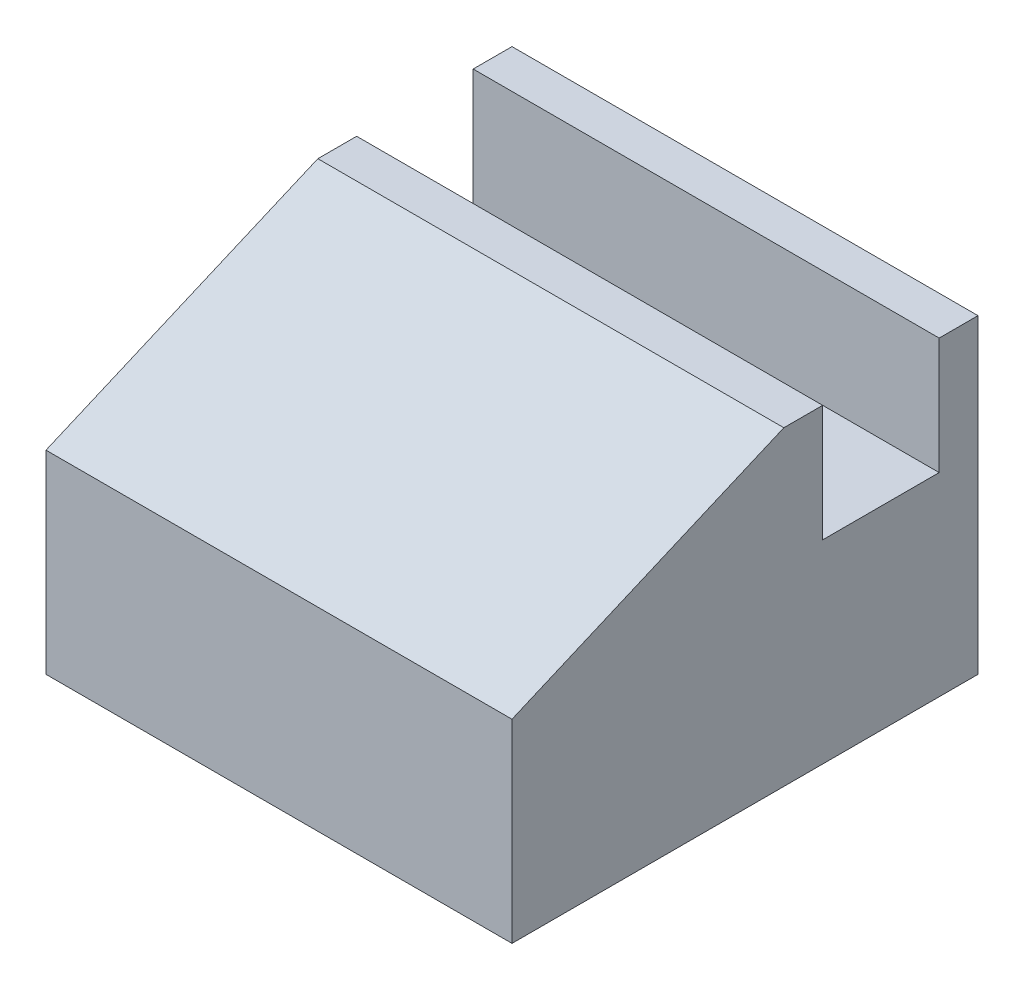
ISO-10303-21;
HEADER;
FILE_DESCRIPTION(('STEP AP214'),'2;1');
FILE_NAME('part.step','',(''),(''),'','','');
FILE_SCHEMA(('AUTOMOTIVE_DESIGN { 1 0 10303 214 1 1 1 1 }'));
ENDSEC;
DATA;
#1=APPLICATION_CONTEXT('core data for automotive mechanical design processes');
#2=APPLICATION_PROTOCOL_DEFINITION('international standard','automotive_design',2000,#1);
#3=PRODUCT_CONTEXT('',#1,'mechanical');
#4=PRODUCT('Part','Part','',(#3));
#5=PRODUCT_RELATED_PRODUCT_CATEGORY('part','',(#4));
#6=PRODUCT_DEFINITION_FORMATION('','',#4);
#7=PRODUCT_DEFINITION_CONTEXT('part definition',#1,'design');
#8=PRODUCT_DEFINITION('design','',#6,#7);
#9=PRODUCT_DEFINITION_SHAPE('','',#8);
#10=(LENGTH_UNIT() NAMED_UNIT(*) SI_UNIT(.MILLI.,.METRE.));
#11=(NAMED_UNIT(*) PLANE_ANGLE_UNIT() SI_UNIT($,.RADIAN.));
#12=(NAMED_UNIT(*) SI_UNIT($,.STERADIAN.) SOLID_ANGLE_UNIT());
#13=UNCERTAINTY_MEASURE_WITH_UNIT(LENGTH_MEASURE(1.E-05),#10,'distance_accuracy_value','');
#14=(GEOMETRIC_REPRESENTATION_CONTEXT(3) GLOBAL_UNCERTAINTY_ASSIGNED_CONTEXT((#13)) GLOBAL_UNIT_ASSIGNED_CONTEXT((#10,
#11,#12)) REPRESENTATION_CONTEXT('',''));
#15=CARTESIAN_POINT('',(0.,0.,0.));
#16=DIRECTION('',(0.,0.,1.));
#17=DIRECTION('',(1.,0.,0.));
#18=AXIS2_PLACEMENT_3D('',#15,#16,#17);
#19=CARTESIAN_POINT('',(76.2,-50.8,0.));
#20=DIRECTION('',(0.,1.,0.));
#21=DIRECTION('',(0.,0.,1.));
#22=AXIS2_PLACEMENT_3D('',#19,#20,#21);
#23=PLANE('',#22);
#24=DIRECTION('',(0.,0.,-1.));
#25=VECTOR('',#24,1.);
#26=CARTESIAN_POINT('',(0.,-50.8,0.));
#27=LINE('',#26,#25);
#28=CARTESIAN_POINT('',(0.,-50.8,76.2));
#29=VERTEX_POINT('',#28);
#30=CARTESIAN_POINT('',(0.,-50.8,0.));
#31=VERTEX_POINT('',#30);
#32=EDGE_CURVE('E223',#29,#31,#27,.T.);
#33=ORIENTED_EDGE('',*,*,#32,.T.);
#34=DIRECTION('',(-1.,0.,0.));
#35=VECTOR('',#34,1.);
#36=CARTESIAN_POINT('',(76.2,-50.8,0.));
#37=LINE('',#36,#35);
#38=CARTESIAN_POINT('',(76.2,-50.8,0.));
#39=VERTEX_POINT('',#38);
#40=EDGE_CURVE('E12',#39,#31,#37,.T.);
#41=ORIENTED_EDGE('',*,*,#40,.F.);
#42=DIRECTION('',(0.,0.,-1.));
#43=VECTOR('',#42,1.);
#44=CARTESIAN_POINT('',(76.2,-50.8,0.));
#45=LINE('',#44,#43);
#46=CARTESIAN_POINT('',(76.2,-50.8,76.2));
#47=VERTEX_POINT('',#46);
#48=EDGE_CURVE('E203',#47,#39,#45,.T.);
#49=ORIENTED_EDGE('',*,*,#48,.F.);
#50=DIRECTION('',(-1.,0.,0.));
#51=VECTOR('',#50,1.);
#52=CARTESIAN_POINT('',(76.2,-50.8,76.2));
#53=LINE('',#52,#51);
#54=EDGE_CURVE('E151',#47,#29,#53,.T.);
#55=ORIENTED_EDGE('',*,*,#54,.T.);
#56=EDGE_LOOP('',(#33,#41,#49,#55));
#57=FACE_BOUND('',#56,.T.);
#58=ADVANCED_FACE('F48',(#57),#23,.F.);
#59=CARTESIAN_POINT('',(76.2,0.,0.));
#60=DIRECTION('',(0.,0.,1.));
#61=DIRECTION('',(0.,-1.,0.));
#62=AXIS2_PLACEMENT_3D('',#59,#60,#61);
#63=PLANE('',#62);
#64=DIRECTION('',(0.,1.,0.));
#65=VECTOR('',#64,1.);
#66=CARTESIAN_POINT('',(0.,0.,0.));
#67=LINE('',#66,#65);
#68=CARTESIAN_POINT('',(0.,0.,0.));
#69=VERTEX_POINT('',#68);
#70=EDGE_CURVE('E221',#31,#69,#67,.T.);
#71=ORIENTED_EDGE('',*,*,#70,.T.);
#72=DIRECTION('',(-1.,0.,0.));
#73=VECTOR('',#72,1.);
#74=CARTESIAN_POINT('',(76.2,0.,0.));
#75=LINE('',#74,#73);
#76=CARTESIAN_POINT('',(76.2,0.,0.));
#77=VERTEX_POINT('',#76);
#78=EDGE_CURVE('E57',#77,#69,#75,.T.);
#79=ORIENTED_EDGE('',*,*,#78,.F.);
#80=DIRECTION('',(0.,1.,0.));
#81=VECTOR('',#80,1.);
#82=CARTESIAN_POINT('',(76.2,0.,0.));
#83=LINE('',#82,#81);
#84=EDGE_CURVE('E111',#39,#77,#83,.T.);
#85=ORIENTED_EDGE('',*,*,#84,.F.);
#86=ORIENTED_EDGE('',*,*,#40,.T.);
#87=EDGE_LOOP('',(#71,#79,#85,#86));
#88=FACE_BOUND('',#87,.T.);
#89=ADVANCED_FACE('F241',(#88),#63,.F.);
#90=CARTESIAN_POINT('',(76.2,0.,6.34999999999999));
#91=DIRECTION('',(0.,-1.,0.));
#92=DIRECTION('',(0.,0.,-1.));
#93=AXIS2_PLACEMENT_3D('',#90,#91,#92);
#94=PLANE('',#93);
#95=DIRECTION('',(0.,0.,1.));
#96=VECTOR('',#95,1.);
#97=CARTESIAN_POINT('',(0.,0.,6.34999999999999));
#98=LINE('',#97,#96);
#99=CARTESIAN_POINT('',(0.,0.,6.34999999999999));
#100=VERTEX_POINT('',#99);
#101=EDGE_CURVE('E218',#69,#100,#98,.T.);
#102=ORIENTED_EDGE('',*,*,#101,.T.);
#103=DIRECTION('',(-1.,0.,0.));
#104=VECTOR('',#103,1.);
#105=CARTESIAN_POINT('',(76.2,0.,6.34999999999999));
#106=LINE('',#105,#104);
#107=CARTESIAN_POINT('',(76.2,0.,6.34999999999999));
#108=VERTEX_POINT('',#107);
#109=EDGE_CURVE('E178',#108,#100,#106,.T.);
#110=ORIENTED_EDGE('',*,*,#109,.F.);
#111=DIRECTION('',(0.,0.,1.));
#112=VECTOR('',#111,1.);
#113=CARTESIAN_POINT('',(76.2,0.,6.34999999999999));
#114=LINE('',#113,#112);
#115=EDGE_CURVE('E189',#77,#108,#114,.T.);
#116=ORIENTED_EDGE('',*,*,#115,.F.);
#117=ORIENTED_EDGE('',*,*,#78,.T.);
#118=EDGE_LOOP('',(#102,#110,#116,#117));
#119=FACE_BOUND('',#118,.T.);
#120=ADVANCED_FACE('F246',(#119),#94,.F.);
#121=CARTESIAN_POINT('',(76.2,-19.05,6.34999999999999));
#122=DIRECTION('',(0.,0.,-1.));
#123=DIRECTION('',(-1.,0.,0.));
#124=AXIS2_PLACEMENT_3D('',#121,#122,#123);
#125=PLANE('',#124);
#126=DIRECTION('',(0.,-1.,0.));
#127=VECTOR('',#126,1.);
#128=CARTESIAN_POINT('',(0.,-19.05,6.34999999999999));
#129=LINE('',#128,#127);
#130=CARTESIAN_POINT('',(0.,-19.05,6.34999999999999));
#131=VERTEX_POINT('',#130);
#132=EDGE_CURVE('E215',#100,#131,#129,.T.);
#133=ORIENTED_EDGE('',*,*,#132,.T.);
#134=DIRECTION('',(-1.,0.,0.));
#135=VECTOR('',#134,1.);
#136=CARTESIAN_POINT('',(76.2,-19.05,6.34999999999999));
#137=LINE('',#136,#135);
#138=CARTESIAN_POINT('',(76.2,-19.05,6.34999999999999));
#139=VERTEX_POINT('',#138);
#140=EDGE_CURVE('E174',#139,#131,#137,.T.);
#141=ORIENTED_EDGE('',*,*,#140,.F.);
#142=DIRECTION('',(0.,-1.,0.));
#143=VECTOR('',#142,1.);
#144=CARTESIAN_POINT('',(76.2,-19.05,6.34999999999999));
#145=LINE('',#144,#143);
#146=EDGE_CURVE('E194',#108,#139,#145,.T.);
#147=ORIENTED_EDGE('',*,*,#146,.F.);
#148=ORIENTED_EDGE('',*,*,#109,.T.);
#149=EDGE_LOOP('',(#133,#141,#147,#148));
#150=FACE_BOUND('',#149,.T.);
#151=ADVANCED_FACE('F250',(#150),#125,.F.);
#152=CARTESIAN_POINT('',(76.2,-19.05,25.4));
#153=DIRECTION('',(0.,-1.,0.));
#154=DIRECTION('',(0.,0.,-1.));
#155=AXIS2_PLACEMENT_3D('',#152,#153,#154);
#156=PLANE('',#155);
#157=DIRECTION('',(0.,0.,1.));
#158=VECTOR('',#157,1.);
#159=CARTESIAN_POINT('',(0.,-19.05,25.4));
#160=LINE('',#159,#158);
#161=CARTESIAN_POINT('',(0.,-19.05,25.4));
#162=VERTEX_POINT('',#161);
#163=EDGE_CURVE('E212',#131,#162,#160,.T.);
#164=ORIENTED_EDGE('',*,*,#163,.T.);
#165=DIRECTION('',(-1.,0.,0.));
#166=VECTOR('',#165,1.);
#167=CARTESIAN_POINT('',(76.2,-19.05,25.4));
#168=LINE('',#167,#166);
#169=CARTESIAN_POINT('',(76.2,-19.05,25.4));
#170=VERTEX_POINT('',#169);
#171=EDGE_CURVE('E170',#170,#162,#168,.T.);
#172=ORIENTED_EDGE('',*,*,#171,.F.);
#173=DIRECTION('',(0.,0.,1.));
#174=VECTOR('',#173,1.);
#175=CARTESIAN_POINT('',(76.2,-19.05,25.4));
#176=LINE('',#175,#174);
#177=EDGE_CURVE('E198',#139,#170,#176,.T.);
#178=ORIENTED_EDGE('',*,*,#177,.F.);
#179=ORIENTED_EDGE('',*,*,#140,.T.);
#180=EDGE_LOOP('',(#164,#172,#178,#179));
#181=FACE_BOUND('',#180,.T.);
#182=ADVANCED_FACE('F254',(#181),#156,.F.);
#183=CARTESIAN_POINT('',(76.2,0.,25.4));
#184=DIRECTION('',(0.,0.,1.));
#185=DIRECTION('',(0.,-1.,0.));
#186=AXIS2_PLACEMENT_3D('',#183,#184,#185);
#187=PLANE('',#186);
#188=DIRECTION('',(0.,1.,0.));
#189=VECTOR('',#188,1.);
#190=CARTESIAN_POINT('',(0.,0.,25.4));
#191=LINE('',#190,#189);
#192=CARTESIAN_POINT('',(0.,0.,25.4));
#193=VERTEX_POINT('',#192);
#194=EDGE_CURVE('E210',#162,#193,#191,.T.);
#195=ORIENTED_EDGE('',*,*,#194,.T.);
#196=DIRECTION('',(-1.,0.,0.));
#197=VECTOR('',#196,1.);
#198=CARTESIAN_POINT('',(76.2,0.,25.4));
#199=LINE('',#198,#197);
#200=CARTESIAN_POINT('',(76.2,0.,25.4));
#201=VERTEX_POINT('',#200);
#202=EDGE_CURVE('E144',#201,#193,#199,.T.);
#203=ORIENTED_EDGE('',*,*,#202,.F.);
#204=DIRECTION('',(0.,1.,0.));
#205=VECTOR('',#204,1.);
#206=CARTESIAN_POINT('',(76.2,0.,25.4));
#207=LINE('',#206,#205);
#208=EDGE_CURVE('E133',#170,#201,#207,.T.);
#209=ORIENTED_EDGE('',*,*,#208,.F.);
#210=ORIENTED_EDGE('',*,*,#171,.T.);
#211=EDGE_LOOP('',(#195,#203,#209,#210));
#212=FACE_BOUND('',#211,.T.);
#213=ADVANCED_FACE('F258',(#212),#187,.F.);
#214=CARTESIAN_POINT('',(76.2,0.,31.75));
#215=DIRECTION('',(0.,-1.,0.));
#216=DIRECTION('',(0.,0.,-1.));
#217=AXIS2_PLACEMENT_3D('',#214,#215,#216);
#218=PLANE('',#217);
#219=DIRECTION('',(0.,0.,1.));
#220=VECTOR('',#219,1.);
#221=CARTESIAN_POINT('',(0.,0.,31.75));
#222=LINE('',#221,#220);
#223=CARTESIAN_POINT('',(0.,0.,31.75));
#224=VERTEX_POINT('',#223);
#225=EDGE_CURVE('E142',#193,#224,#222,.T.);
#226=ORIENTED_EDGE('',*,*,#225,.T.);
#227=DIRECTION('',(-1.,0.,0.));
#228=VECTOR('',#227,1.);
#229=CARTESIAN_POINT('',(76.2,0.,31.75));
#230=LINE('',#229,#228);
#231=CARTESIAN_POINT('',(76.2,0.,31.75));
#232=VERTEX_POINT('',#231);
#233=EDGE_CURVE('E139',#232,#224,#230,.T.);
#234=ORIENTED_EDGE('',*,*,#233,.F.);
#235=DIRECTION('',(0.,0.,1.));
#236=VECTOR('',#235,1.);
#237=CARTESIAN_POINT('',(76.2,0.,31.75));
#238=LINE('',#237,#236);
#239=EDGE_CURVE('E127',#201,#232,#238,.T.);
#240=ORIENTED_EDGE('',*,*,#239,.F.);
#241=ORIENTED_EDGE('',*,*,#202,.T.);
#242=EDGE_LOOP('',(#226,#234,#240,#241));
#243=FACE_BOUND('',#242,.T.);
#244=ADVANCED_FACE('F140',(#243),#218,.F.);
#245=CARTESIAN_POINT('',(76.2,-19.05,76.2));
#246=DIRECTION('',(0.,-0.919145030018058,-0.393919298579168));
#247=DIRECTION('',(0.,0.393919298579168,-0.919145030018058));
#248=AXIS2_PLACEMENT_3D('',#245,#246,#247);
#249=PLANE('',#248);
#250=DIRECTION('',(0.,-0.393919298579168,0.919145030018058));
#251=VECTOR('',#250,1.);
#252=CARTESIAN_POINT('',(0.,-19.05,76.2));
#253=LINE('',#252,#251);
#254=CARTESIAN_POINT('',(0.,-19.05,76.2));
#255=VERTEX_POINT('',#254);
#256=EDGE_CURVE('E97',#224,#255,#253,.T.);
#257=ORIENTED_EDGE('',*,*,#256,.T.);
#258=DIRECTION('',(-1.,0.,0.));
#259=VECTOR('',#258,1.);
#260=CARTESIAN_POINT('',(76.2,-19.05,76.2));
#261=LINE('',#260,#259);
#262=CARTESIAN_POINT('',(76.2,-19.05,76.2));
#263=VERTEX_POINT('',#262);
#264=EDGE_CURVE('E145',#263,#255,#261,.T.);
#265=ORIENTED_EDGE('',*,*,#264,.F.);
#266=DIRECTION('',(0.,-0.393919298579168,0.919145030018058));
#267=VECTOR('',#266,1.);
#268=CARTESIAN_POINT('',(76.2,-19.05,76.2));
#269=LINE('',#268,#267);
#270=EDGE_CURVE('E131',#232,#263,#269,.T.);
#271=ORIENTED_EDGE('',*,*,#270,.F.);
#272=ORIENTED_EDGE('',*,*,#233,.T.);
#273=EDGE_LOOP('',(#257,#265,#271,#272));
#274=FACE_BOUND('',#273,.T.);
#275=ADVANCED_FACE('F147',(#274),#249,.F.);
#276=CARTESIAN_POINT('',(76.2,-50.8,76.2));
#277=DIRECTION('',(0.,0.,-1.));
#278=DIRECTION('',(-1.,0.,0.));
#279=AXIS2_PLACEMENT_3D('',#276,#277,#278);
#280=PLANE('',#279);
#281=DIRECTION('',(0.,-1.,0.));
#282=VECTOR('',#281,1.);
#283=CARTESIAN_POINT('',(0.,-50.8,76.2));
#284=LINE('',#283,#282);
#285=EDGE_CURVE('E103',#255,#29,#284,.T.);
#286=ORIENTED_EDGE('',*,*,#285,.T.);
#287=ORIENTED_EDGE('',*,*,#54,.F.);
#288=DIRECTION('',(0.,-1.,0.));
#289=VECTOR('',#288,1.);
#290=CARTESIAN_POINT('',(76.2,-50.8,76.2));
#291=LINE('',#290,#289);
#292=EDGE_CURVE('E65',#263,#47,#291,.T.);
#293=ORIENTED_EDGE('',*,*,#292,.F.);
#294=ORIENTED_EDGE('',*,*,#264,.T.);
#295=EDGE_LOOP('',(#286,#287,#293,#294));
#296=FACE_BOUND('',#295,.T.);
#297=ADVANCED_FACE('F235',(#296),#280,.F.);
#298=CARTESIAN_POINT('',(76.2,0.,0.));
#299=DIRECTION('',(-1.,0.,0.));
#300=DIRECTION('',(0.,0.,1.));
#301=AXIS2_PLACEMENT_3D('',#298,#299,#300);
#302=PLANE('',#301);
#303=ORIENTED_EDGE('',*,*,#48,.T.);
#304=ORIENTED_EDGE('',*,*,#84,.T.);
#305=ORIENTED_EDGE('',*,*,#115,.T.);
#306=ORIENTED_EDGE('',*,*,#146,.T.);
#307=ORIENTED_EDGE('',*,*,#177,.T.);
#308=ORIENTED_EDGE('',*,*,#208,.T.);
#309=ORIENTED_EDGE('',*,*,#239,.T.);
#310=ORIENTED_EDGE('',*,*,#270,.T.);
#311=ORIENTED_EDGE('',*,*,#292,.T.);
#312=EDGE_LOOP('',(#303,#304,#305,#306,#307,#308,#309,#310,#311));
#313=FACE_BOUND('',#312,.T.);
#314=ADVANCED_FACE('F129',(#313),#302,.F.);
#315=CARTESIAN_POINT('',(0.,0.,0.));
#316=DIRECTION('',(-1.,0.,0.));
#317=DIRECTION('',(0.,0.,1.));
#318=AXIS2_PLACEMENT_3D('',#315,#316,#317);
#319=PLANE('',#318);
#320=ORIENTED_EDGE('',*,*,#32,.F.);
#321=ORIENTED_EDGE('',*,*,#285,.F.);
#322=ORIENTED_EDGE('',*,*,#256,.F.);
#323=ORIENTED_EDGE('',*,*,#225,.F.);
#324=ORIENTED_EDGE('',*,*,#194,.F.);
#325=ORIENTED_EDGE('',*,*,#163,.F.);
#326=ORIENTED_EDGE('',*,*,#132,.F.);
#327=ORIENTED_EDGE('',*,*,#101,.F.);
#328=ORIENTED_EDGE('',*,*,#70,.F.);
#329=EDGE_LOOP('',(#320,#321,#322,#323,#324,#325,#326,#327,#328));
#330=FACE_BOUND('',#329,.T.);
#331=ADVANCED_FACE('F237',(#330),#319,.T.);
#332=CLOSED_SHELL('',(#58,#89,#120,#151,#182,#213,#244,#275,#297,#314,#331));
#333=MANIFOLD_SOLID_BREP('B2',#332);
#334=ADVANCED_BREP_SHAPE_REPRESENTATION('',(#18,#333),#14);
#335=SHAPE_DEFINITION_REPRESENTATION(#9,#334);
ENDSEC;
END-ISO-10303-21;
